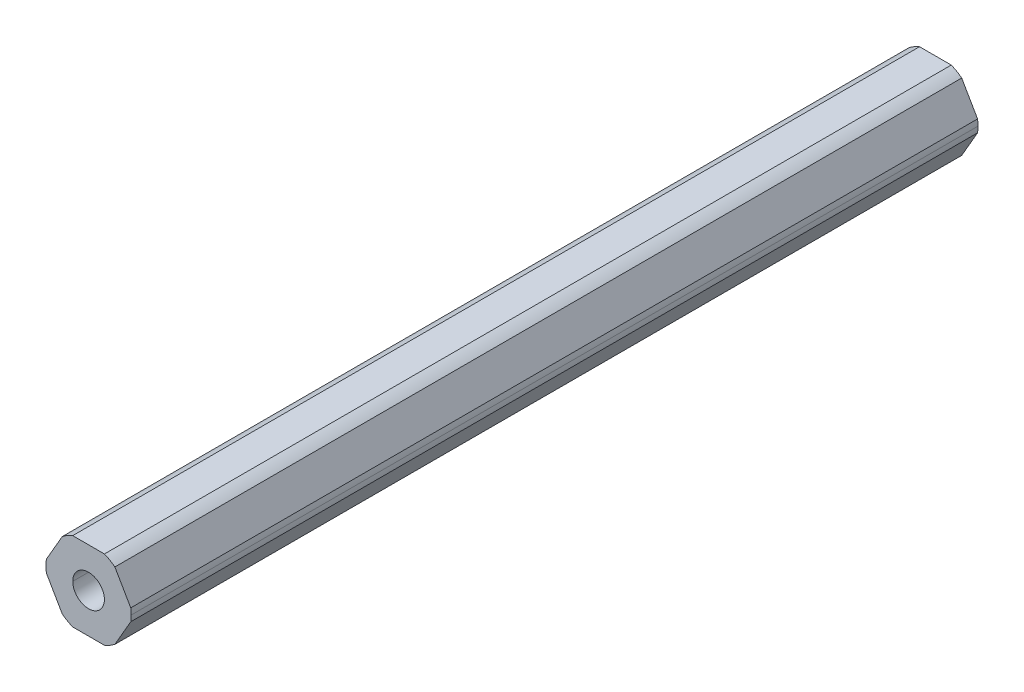
ISO-10303-21;
HEADER;
FILE_DESCRIPTION(('STEP AP214'),'2;1');
FILE_NAME('part.step','',(''),(''),'','','');
FILE_SCHEMA(('AUTOMOTIVE_DESIGN { 1 0 10303 214 1 1 1 1 }'));
ENDSEC;
DATA;
#1=APPLICATION_CONTEXT('core data for automotive mechanical design processes');
#2=APPLICATION_PROTOCOL_DEFINITION('international standard','automotive_design',2000,#1);
#3=PRODUCT_CONTEXT('',#1,'mechanical');
#4=PRODUCT('Part','Part','',(#3));
#5=PRODUCT_RELATED_PRODUCT_CATEGORY('part','',(#4));
#6=PRODUCT_DEFINITION_FORMATION('','',#4);
#7=PRODUCT_DEFINITION_CONTEXT('part definition',#1,'design');
#8=PRODUCT_DEFINITION('design','',#6,#7);
#9=PRODUCT_DEFINITION_SHAPE('','',#8);
#10=(LENGTH_UNIT() NAMED_UNIT(*) SI_UNIT(.MILLI.,.METRE.));
#11=(NAMED_UNIT(*) PLANE_ANGLE_UNIT() SI_UNIT($,.RADIAN.));
#12=(NAMED_UNIT(*) SI_UNIT($,.STERADIAN.) SOLID_ANGLE_UNIT());
#13=UNCERTAINTY_MEASURE_WITH_UNIT(LENGTH_MEASURE(1.E-05),#10,'distance_accuracy_value','');
#14=(GEOMETRIC_REPRESENTATION_CONTEXT(3) GLOBAL_UNCERTAINTY_ASSIGNED_CONTEXT((#13)) GLOBAL_UNIT_ASSIGNED_CONTEXT((#10,
#11,#12)) REPRESENTATION_CONTEXT('',''));
#15=CARTESIAN_POINT('',(0.,0.,0.));
#16=DIRECTION('',(0.,0.,1.));
#17=DIRECTION('',(1.,0.,0.));
#18=AXIS2_PLACEMENT_3D('',#15,#16,#17);
#19=CARTESIAN_POINT('',(0.,0.,-457.2));
#20=DIRECTION('',(0.,0.,1.));
#21=DIRECTION('',(1.,0.,0.));
#22=AXIS2_PLACEMENT_3D('',#19,#20,#21);
#23=CYLINDRICAL_SURFACE('',#22,2.55);
#24=CARTESIAN_POINT('',(0.,0.,-320.675));
#25=DIRECTION('',(0.,0.,1.));
#26=DIRECTION('',(1.,0.,0.));
#27=AXIS2_PLACEMENT_3D('',#24,#25,#26);
#28=CIRCLE('',#27,2.55);
#29=CARTESIAN_POINT('',(-2.55,0.,-320.675));
#30=VERTEX_POINT('',#29);
#31=CARTESIAN_POINT('',(2.55,0.,-320.675));
#32=VERTEX_POINT('',#31);
#33=EDGE_CURVE('E65',#30,#32,#28,.F.);
#34=ORIENTED_EDGE('',*,*,#33,.F.);
#35=DIRECTION('',(0.,0.,1.));
#36=VECTOR('',#35,1.);
#37=CARTESIAN_POINT('',(-2.55,0.,-457.2));
#38=LINE('',#37,#36);
#39=CARTESIAN_POINT('',(-2.55,0.,-457.2));
#40=VERTEX_POINT('',#39);
#41=EDGE_CURVE('E169',#40,#30,#38,.T.);
#42=ORIENTED_EDGE('',*,*,#41,.F.);
#43=CARTESIAN_POINT('',(0.,0.,-457.2));
#44=DIRECTION('',(0.,0.,1.));
#45=DIRECTION('',(1.,0.,0.));
#46=AXIS2_PLACEMENT_3D('',#43,#44,#45);
#47=CIRCLE('',#46,2.55);
#48=CARTESIAN_POINT('',(2.55,0.,-457.2));
#49=VERTEX_POINT('',#48);
#50=EDGE_CURVE('E52',#49,#40,#47,.T.);
#51=ORIENTED_EDGE('',*,*,#50,.F.);
#52=DIRECTION('',(0.,0.,1.));
#53=VECTOR('',#52,1.);
#54=CARTESIAN_POINT('',(2.55,0.,-457.2));
#55=LINE('',#54,#53);
#56=EDGE_CURVE('E171',#49,#32,#55,.T.);
#57=ORIENTED_EDGE('',*,*,#56,.T.);
#58=EDGE_LOOP('',(#34,#42,#51,#57));
#59=FACE_BOUND('',#58,.T.);
#60=ADVANCED_FACE('F44',(#59),#23,.F.);
#61=CARTESIAN_POINT('',(0.,0.,-457.2));
#62=DIRECTION('',(0.,0.,1.));
#63=DIRECTION('',(1.,0.,0.));
#64=AXIS2_PLACEMENT_3D('',#61,#62,#63);
#65=CYLINDRICAL_SURFACE('',#64,6.87);
#66=DIRECTION('',(0.,0.,1.));
#67=VECTOR('',#66,1.);
#68=CARTESIAN_POINT('',(2.55952629210952,6.3754,-457.2));
#69=LINE('',#68,#67);
#70=CARTESIAN_POINT('',(2.55952629210952,6.3754,-457.2));
#71=VERTEX_POINT('',#70);
#72=CARTESIAN_POINT('',(2.55952629210953,6.3754,-320.675));
#73=VERTEX_POINT('',#72);
#74=EDGE_CURVE('E213',#71,#73,#69,.T.);
#75=ORIENTED_EDGE('',*,*,#74,.T.);
#76=CARTESIAN_POINT('',(0.,0.,-320.675));
#77=DIRECTION('',(0.,0.,1.));
#78=DIRECTION('',(1.,0.,0.));
#79=AXIS2_PLACEMENT_3D('',#76,#77,#78);
#80=CIRCLE('',#79,6.87);
#81=CARTESIAN_POINT('',(4.24149521323254,5.40431479062105,-320.675));
#82=VERTEX_POINT('',#81);
#83=EDGE_CURVE('E285',#73,#82,#80,.F.);
#84=ORIENTED_EDGE('',*,*,#83,.T.);
#85=DIRECTION('',(0.,0.,-1.));
#86=VECTOR('',#85,1.);
#87=CARTESIAN_POINT('',(4.24149521323254,5.40431479062105,-457.2));
#88=LINE('',#87,#86);
#89=CARTESIAN_POINT('',(4.24149521323254,5.40431479062105,-457.2));
#90=VERTEX_POINT('',#89);
#91=EDGE_CURVE('E218',#82,#90,#88,.T.);
#92=ORIENTED_EDGE('',*,*,#91,.T.);
#93=CARTESIAN_POINT('',(0.,0.,-457.2));
#94=DIRECTION('',(0.,0.,1.));
#95=DIRECTION('',(1.,0.,0.));
#96=AXIS2_PLACEMENT_3D('',#93,#94,#95);
#97=CIRCLE('',#96,6.87);
#98=EDGE_CURVE('E244',#90,#71,#97,.T.);
#99=ORIENTED_EDGE('',*,*,#98,.T.);
#100=EDGE_LOOP('',(#75,#84,#92,#99));
#101=FACE_BOUND('',#100,.T.);
#102=ADVANCED_FACE('F324',(#101),#65,.T.);
#103=CARTESIAN_POINT('',(0.,0.,-457.2));
#104=DIRECTION('',(0.,0.,1.));
#105=DIRECTION('',(1.,0.,0.));
#106=AXIS2_PLACEMENT_3D('',#103,#104,#105);
#107=CYLINDRICAL_SURFACE('',#106,6.87);
#108=DIRECTION('',(0.,0.,1.));
#109=VECTOR('',#108,1.);
#110=CARTESIAN_POINT('',(-4.24149521323255,5.40431479062105,-457.2));
#111=LINE('',#110,#109);
#112=CARTESIAN_POINT('',(-4.24149521323255,5.40431479062105,-457.2));
#113=VERTEX_POINT('',#112);
#114=CARTESIAN_POINT('',(-4.24149521323255,5.40431479062105,-320.675));
#115=VERTEX_POINT('',#114);
#116=EDGE_CURVE('E243',#113,#115,#111,.T.);
#117=ORIENTED_EDGE('',*,*,#116,.T.);
#118=CARTESIAN_POINT('',(0.,0.,-320.675));
#119=DIRECTION('',(0.,0.,1.));
#120=DIRECTION('',(1.,0.,0.));
#121=AXIS2_PLACEMENT_3D('',#118,#119,#120);
#122=CIRCLE('',#121,6.87);
#123=CARTESIAN_POINT('',(-2.55952629210953,6.3754,-320.675));
#124=VERTEX_POINT('',#123);
#125=EDGE_CURVE('E275',#115,#124,#122,.F.);
#126=ORIENTED_EDGE('',*,*,#125,.T.);
#127=DIRECTION('',(0.,0.,-1.));
#128=VECTOR('',#127,1.);
#129=CARTESIAN_POINT('',(-2.55952629210953,6.3754,-457.2));
#130=LINE('',#129,#128);
#131=CARTESIAN_POINT('',(-2.55952629210953,6.3754,-457.2));
#132=VERTEX_POINT('',#131);
#133=EDGE_CURVE('E226',#124,#132,#130,.T.);
#134=ORIENTED_EDGE('',*,*,#133,.T.);
#135=CARTESIAN_POINT('',(0.,0.,-457.2));
#136=DIRECTION('',(0.,0.,1.));
#137=DIRECTION('',(1.,0.,0.));
#138=AXIS2_PLACEMENT_3D('',#135,#136,#137);
#139=CIRCLE('',#138,6.87);
#140=EDGE_CURVE('E222',#132,#113,#139,.T.);
#141=ORIENTED_EDGE('',*,*,#140,.T.);
#142=EDGE_LOOP('',(#117,#126,#134,#141));
#143=FACE_BOUND('',#142,.T.);
#144=ADVANCED_FACE('F335',(#143),#107,.T.);
#145=CARTESIAN_POINT('',(0.,0.,-457.2));
#146=DIRECTION('',(0.,0.,1.));
#147=DIRECTION('',(1.,0.,0.));
#148=AXIS2_PLACEMENT_3D('',#145,#146,#147);
#149=CYLINDRICAL_SURFACE('',#148,6.87);
#150=DIRECTION('',(0.,0.,1.));
#151=VECTOR('',#150,1.);
#152=CARTESIAN_POINT('',(-6.80102150534208,-0.971085209378962,-457.2));
#153=LINE('',#152,#151);
#154=CARTESIAN_POINT('',(-6.80102150534208,-0.971085209378956,-457.2));
#155=VERTEX_POINT('',#154);
#156=CARTESIAN_POINT('',(-6.80102150534207,-0.971085209378956,-320.675));
#157=VERTEX_POINT('',#156);
#158=EDGE_CURVE('E191',#155,#157,#153,.T.);
#159=ORIENTED_EDGE('',*,*,#158,.T.);
#160=CARTESIAN_POINT('',(0.,0.,-320.675));
#161=DIRECTION('',(0.,0.,1.));
#162=DIRECTION('',(1.,0.,0.));
#163=AXIS2_PLACEMENT_3D('',#160,#161,#162);
#164=CIRCLE('',#163,6.87);
#165=CARTESIAN_POINT('',(-6.80102150534208,0.97108520937896,-320.675));
#166=VERTEX_POINT('',#165);
#167=EDGE_CURVE('E278',#157,#166,#164,.F.);
#168=ORIENTED_EDGE('',*,*,#167,.T.);
#169=DIRECTION('',(0.,0.,-1.));
#170=VECTOR('',#169,1.);
#171=CARTESIAN_POINT('',(-6.80102150534208,0.97108520937896,-457.2));
#172=LINE('',#171,#170);
#173=CARTESIAN_POINT('',(-6.80102150534208,0.97108520937896,-457.2));
#174=VERTEX_POINT('',#173);
#175=EDGE_CURVE('E210',#166,#174,#172,.T.);
#176=ORIENTED_EDGE('',*,*,#175,.T.);
#177=CARTESIAN_POINT('',(0.,0.,-457.2));
#178=DIRECTION('',(0.,0.,1.));
#179=DIRECTION('',(1.,0.,0.));
#180=AXIS2_PLACEMENT_3D('',#177,#178,#179);
#181=CIRCLE('',#180,6.87);
#182=EDGE_CURVE('E233',#174,#155,#181,.T.);
#183=ORIENTED_EDGE('',*,*,#182,.T.);
#184=EDGE_LOOP('',(#159,#168,#176,#183));
#185=FACE_BOUND('',#184,.T.);
#186=ADVANCED_FACE('F342',(#185),#149,.T.);
#187=CARTESIAN_POINT('',(0.,0.,-457.2));
#188=DIRECTION('',(0.,0.,1.));
#189=DIRECTION('',(1.,0.,0.));
#190=AXIS2_PLACEMENT_3D('',#187,#188,#189);
#191=CYLINDRICAL_SURFACE('',#190,6.87);
#192=DIRECTION('',(0.,0.,1.));
#193=VECTOR('',#192,1.);
#194=CARTESIAN_POINT('',(-2.55952629210953,-6.3754,-457.2));
#195=LINE('',#194,#193);
#196=CARTESIAN_POINT('',(-2.55952629210953,-6.3754,-457.2));
#197=VERTEX_POINT('',#196);
#198=CARTESIAN_POINT('',(-2.55952629210953,-6.3754,-320.675));
#199=VERTEX_POINT('',#198);
#200=EDGE_CURVE('E202',#197,#199,#195,.T.);
#201=ORIENTED_EDGE('',*,*,#200,.T.);
#202=CARTESIAN_POINT('',(0.,0.,-320.675));
#203=DIRECTION('',(0.,0.,1.));
#204=DIRECTION('',(1.,0.,0.));
#205=AXIS2_PLACEMENT_3D('',#202,#203,#204);
#206=CIRCLE('',#205,6.87);
#207=CARTESIAN_POINT('',(-4.24149521323254,-5.40431479062105,-320.675));
#208=VERTEX_POINT('',#207);
#209=EDGE_CURVE('E288',#199,#208,#206,.F.);
#210=ORIENTED_EDGE('',*,*,#209,.T.);
#211=DIRECTION('',(0.,0.,-1.));
#212=VECTOR('',#211,1.);
#213=CARTESIAN_POINT('',(-4.24149521323255,-5.40431479062104,-457.2));
#214=LINE('',#213,#212);
#215=CARTESIAN_POINT('',(-4.24149521323254,-5.40431479062105,-457.2));
#216=VERTEX_POINT('',#215);
#217=EDGE_CURVE('E190',#208,#216,#214,.T.);
#218=ORIENTED_EDGE('',*,*,#217,.T.);
#219=CARTESIAN_POINT('',(0.,0.,-457.2));
#220=DIRECTION('',(0.,0.,1.));
#221=DIRECTION('',(1.,0.,0.));
#222=AXIS2_PLACEMENT_3D('',#219,#220,#221);
#223=CIRCLE('',#222,6.87);
#224=EDGE_CURVE('E236',#216,#197,#223,.T.);
#225=ORIENTED_EDGE('',*,*,#224,.T.);
#226=EDGE_LOOP('',(#201,#210,#218,#225));
#227=FACE_BOUND('',#226,.T.);
#228=ADVANCED_FACE('F351',(#227),#191,.T.);
#229=CARTESIAN_POINT('',(0.,0.,-457.2));
#230=DIRECTION('',(0.,0.,1.));
#231=DIRECTION('',(1.,0.,0.));
#232=AXIS2_PLACEMENT_3D('',#229,#230,#231);
#233=CYLINDRICAL_SURFACE('',#232,6.87);
#234=DIRECTION('',(0.,0.,1.));
#235=VECTOR('',#234,1.);
#236=CARTESIAN_POINT('',(4.24149521323255,-5.40431479062104,-457.2));
#237=LINE('',#236,#235);
#238=CARTESIAN_POINT('',(4.24149521323254,-5.40431479062105,-457.2));
#239=VERTEX_POINT('',#238);
#240=CARTESIAN_POINT('',(4.24149521323254,-5.40431479062105,-320.675));
#241=VERTEX_POINT('',#240);
#242=EDGE_CURVE('E195',#239,#241,#237,.T.);
#243=ORIENTED_EDGE('',*,*,#242,.T.);
#244=CARTESIAN_POINT('',(0.,0.,-320.675));
#245=DIRECTION('',(0.,0.,1.));
#246=DIRECTION('',(1.,0.,0.));
#247=AXIS2_PLACEMENT_3D('',#244,#245,#246);
#248=CIRCLE('',#247,6.87);
#249=CARTESIAN_POINT('',(2.55952629210953,-6.3754,-320.675));
#250=VERTEX_POINT('',#249);
#251=EDGE_CURVE('E295',#241,#250,#248,.F.);
#252=ORIENTED_EDGE('',*,*,#251,.T.);
#253=DIRECTION('',(0.,0.,-1.));
#254=VECTOR('',#253,1.);
#255=CARTESIAN_POINT('',(2.55952629210953,-6.3754,-457.2));
#256=LINE('',#255,#254);
#257=CARTESIAN_POINT('',(2.55952629210953,-6.3754,-457.2));
#258=VERTEX_POINT('',#257);
#259=EDGE_CURVE('E201',#250,#258,#256,.T.);
#260=ORIENTED_EDGE('',*,*,#259,.T.);
#261=CARTESIAN_POINT('',(0.,0.,-457.2));
#262=DIRECTION('',(0.,0.,1.));
#263=DIRECTION('',(1.,0.,0.));
#264=AXIS2_PLACEMENT_3D('',#261,#262,#263);
#265=CIRCLE('',#264,6.87);
#266=EDGE_CURVE('E239',#258,#239,#265,.T.);
#267=ORIENTED_EDGE('',*,*,#266,.T.);
#268=EDGE_LOOP('',(#243,#252,#260,#267));
#269=FACE_BOUND('',#268,.T.);
#270=ADVANCED_FACE('F358',(#269),#233,.T.);
#271=CARTESIAN_POINT('',(0.,0.,-457.2));
#272=DIRECTION('',(0.,0.,1.));
#273=DIRECTION('',(1.,0.,0.));
#274=AXIS2_PLACEMENT_3D('',#271,#272,#273);
#275=CYLINDRICAL_SURFACE('',#274,6.87);
#276=DIRECTION('',(0.,0.,1.));
#277=VECTOR('',#276,1.);
#278=CARTESIAN_POINT('',(6.80102150534208,0.971085209378949,-457.2));
#279=LINE('',#278,#277);
#280=CARTESIAN_POINT('',(6.80102150534208,0.97108520937895,-457.2));
#281=VERTEX_POINT('',#280);
#282=CARTESIAN_POINT('',(6.80102150534208,0.97108520937895,-320.675));
#283=VERTEX_POINT('',#282);
#284=EDGE_CURVE('E203',#281,#283,#279,.T.);
#285=ORIENTED_EDGE('',*,*,#284,.T.);
#286=CARTESIAN_POINT('',(0.,0.,-320.675));
#287=DIRECTION('',(0.,0.,1.));
#288=DIRECTION('',(1.,0.,0.));
#289=AXIS2_PLACEMENT_3D('',#286,#287,#288);
#290=CIRCLE('',#289,6.87);
#291=CARTESIAN_POINT('',(6.87,0.,-320.675));
#292=VERTEX_POINT('',#291);
#293=EDGE_CURVE('E298',#283,#292,#290,.F.);
#294=ORIENTED_EDGE('',*,*,#293,.T.);
#295=DIRECTION('',(0.,0.,1.));
#296=VECTOR('',#295,1.);
#297=CARTESIAN_POINT('',(6.87,0.,-457.2));
#298=LINE('',#297,#296);
#299=CARTESIAN_POINT('',(6.87,0.,-457.2));
#300=VERTEX_POINT('',#299);
#301=EDGE_CURVE('E196',#300,#292,#298,.T.);
#302=ORIENTED_EDGE('',*,*,#301,.F.);
#303=CARTESIAN_POINT('',(0.,0.,-457.2));
#304=DIRECTION('',(0.,0.,1.));
#305=DIRECTION('',(1.,0.,0.));
#306=AXIS2_PLACEMENT_3D('',#303,#304,#305);
#307=CIRCLE('',#306,6.87);
#308=EDGE_CURVE('E247',#300,#281,#307,.T.);
#309=ORIENTED_EDGE('',*,*,#308,.T.);
#310=EDGE_LOOP('',(#285,#294,#302,#309));
#311=FACE_BOUND('',#310,.T.);
#312=ADVANCED_FACE('F318',(#311),#275,.T.);
#313=CARTESIAN_POINT('',(-3.68083890619154,-6.3754,457.2));
#314=DIRECTION('',(0.,1.,0.));
#315=DIRECTION('',(1.,0.,0.));
#316=AXIS2_PLACEMENT_3D('',#313,#314,#315);
#317=PLANE('',#316);
#318=DIRECTION('',(1.,0.,0.));
#319=VECTOR('',#318,1.);
#320=CARTESIAN_POINT('',(-3.68083890619154,-6.3754,-320.675));
#321=LINE('',#320,#319);
#322=EDGE_CURVE('E291',#199,#250,#321,.T.);
#323=ORIENTED_EDGE('',*,*,#322,.F.);
#324=ORIENTED_EDGE('',*,*,#200,.F.);
#325=DIRECTION('',(1.,0.,0.));
#326=VECTOR('',#325,1.);
#327=CARTESIAN_POINT('',(-3.68083890619154,-6.3754,-457.2));
#328=LINE('',#327,#326);
#329=EDGE_CURVE('E197',#197,#258,#328,.T.);
#330=ORIENTED_EDGE('',*,*,#329,.T.);
#331=ORIENTED_EDGE('',*,*,#259,.F.);
#332=EDGE_LOOP('',(#323,#324,#330,#331));
#333=FACE_BOUND('',#332,.T.);
#334=ADVANCED_FACE('F46',(#333),#317,.F.);
#335=CARTESIAN_POINT('',(-7.36167781238308,0.,457.2));
#336=DIRECTION('',(0.866025403784439,0.5,0.));
#337=DIRECTION('',(0.,0.,-1.));
#338=AXIS2_PLACEMENT_3D('',#335,#336,#337);
#339=PLANE('',#338);
#340=DIRECTION('',(0.5,-0.866025403784439,0.));
#341=VECTOR('',#340,1.);
#342=CARTESIAN_POINT('',(-7.36167781238308,0.,-320.675));
#343=LINE('',#342,#341);
#344=EDGE_CURVE('E281',#157,#208,#343,.T.);
#345=ORIENTED_EDGE('',*,*,#344,.F.);
#346=ORIENTED_EDGE('',*,*,#158,.F.);
#347=DIRECTION('',(0.5,-0.866025403784439,0.));
#348=VECTOR('',#347,1.);
#349=CARTESIAN_POINT('',(-7.36167781238308,0.,-457.2));
#350=LINE('',#349,#348);
#351=EDGE_CURVE('E188',#155,#216,#350,.T.);
#352=ORIENTED_EDGE('',*,*,#351,.T.);
#353=ORIENTED_EDGE('',*,*,#217,.F.);
#354=EDGE_LOOP('',(#345,#346,#352,#353));
#355=FACE_BOUND('',#354,.T.);
#356=ADVANCED_FACE('F347',(#355),#339,.F.);
#357=CARTESIAN_POINT('',(-3.68083890619154,6.3754,457.2));
#358=DIRECTION('',(0.866025403784439,-0.5,0.));
#359=DIRECTION('',(0.,0.,-1.));
#360=AXIS2_PLACEMENT_3D('',#357,#358,#359);
#361=PLANE('',#360);
#362=DIRECTION('',(-0.5,-0.866025403784439,0.));
#363=VECTOR('',#362,1.);
#364=CARTESIAN_POINT('',(-3.68083890619154,6.3754,-320.675));
#365=LINE('',#364,#363);
#366=EDGE_CURVE('E185',#115,#166,#365,.T.);
#367=ORIENTED_EDGE('',*,*,#366,.F.);
#368=ORIENTED_EDGE('',*,*,#116,.F.);
#369=DIRECTION('',(-0.5,-0.866025403784439,0.));
#370=VECTOR('',#369,1.);
#371=CARTESIAN_POINT('',(-3.68083890619154,6.3754,-457.2));
#372=LINE('',#371,#370);
#373=EDGE_CURVE('E212',#113,#174,#372,.T.);
#374=ORIENTED_EDGE('',*,*,#373,.T.);
#375=ORIENTED_EDGE('',*,*,#175,.F.);
#376=EDGE_LOOP('',(#367,#368,#374,#375));
#377=FACE_BOUND('',#376,.T.);
#378=ADVANCED_FACE('F338',(#377),#361,.F.);
#379=CARTESIAN_POINT('',(3.68083890619154,6.3754,457.2));
#380=DIRECTION('',(0.,-1.,0.));
#381=DIRECTION('',(0.,0.,-1.));
#382=AXIS2_PLACEMENT_3D('',#379,#380,#381);
#383=PLANE('',#382);
#384=DIRECTION('',(-1.,0.,0.));
#385=VECTOR('',#384,1.);
#386=CARTESIAN_POINT('',(3.68083890619154,6.3754,-320.675));
#387=LINE('',#386,#385);
#388=EDGE_CURVE('E283',#73,#124,#387,.T.);
#389=ORIENTED_EDGE('',*,*,#388,.F.);
#390=ORIENTED_EDGE('',*,*,#74,.F.);
#391=DIRECTION('',(-1.,0.,0.));
#392=VECTOR('',#391,1.);
#393=CARTESIAN_POINT('',(3.68083890619154,6.3754,-457.2));
#394=LINE('',#393,#392);
#395=EDGE_CURVE('E217',#71,#132,#394,.T.);
#396=ORIENTED_EDGE('',*,*,#395,.T.);
#397=ORIENTED_EDGE('',*,*,#133,.F.);
#398=EDGE_LOOP('',(#389,#390,#396,#397));
#399=FACE_BOUND('',#398,.T.);
#400=ADVANCED_FACE('F332',(#399),#383,.F.);
#401=CARTESIAN_POINT('',(7.36167781238308,0.,457.2));
#402=DIRECTION('',(-0.866025403784439,-0.5,0.));
#403=DIRECTION('',(-0.5,0.866025403784439,0.));
#404=AXIS2_PLACEMENT_3D('',#401,#402,#403);
#405=PLANE('',#404);
#406=DIRECTION('',(-0.5,0.866025403784439,0.));
#407=VECTOR('',#406,1.);
#408=CARTESIAN_POINT('',(7.36167781238308,0.,-320.675));
#409=LINE('',#408,#407);
#410=EDGE_CURVE('E293',#283,#82,#409,.T.);
#411=ORIENTED_EDGE('',*,*,#410,.F.);
#412=ORIENTED_EDGE('',*,*,#284,.F.);
#413=DIRECTION('',(-0.5,0.866025403784439,0.));
#414=VECTOR('',#413,1.);
#415=CARTESIAN_POINT('',(7.36167781238308,0.,-457.2));
#416=LINE('',#415,#414);
#417=EDGE_CURVE('E207',#281,#90,#416,.T.);
#418=ORIENTED_EDGE('',*,*,#417,.T.);
#419=ORIENTED_EDGE('',*,*,#91,.F.);
#420=EDGE_LOOP('',(#411,#412,#418,#419));
#421=FACE_BOUND('',#420,.T.);
#422=ADVANCED_FACE('F322',(#421),#405,.F.);
#423=CARTESIAN_POINT('',(3.68083890619154,-6.3754,457.2));
#424=DIRECTION('',(-0.866025403784439,0.5,0.));
#425=DIRECTION('',(0.,0.,1.));
#426=AXIS2_PLACEMENT_3D('',#423,#424,#425);
#427=PLANE('',#426);
#428=DIRECTION('',(0.5,0.866025403784439,0.));
#429=VECTOR('',#428,1.);
#430=CARTESIAN_POINT('',(3.68083890619154,-6.3754,-320.675));
#431=LINE('',#430,#429);
#432=CARTESIAN_POINT('',(6.80102150534208,-0.971085209378962,-320.675));
#433=VERTEX_POINT('',#432);
#434=EDGE_CURVE('E59',#241,#433,#431,.T.);
#435=ORIENTED_EDGE('',*,*,#434,.F.);
#436=ORIENTED_EDGE('',*,*,#242,.F.);
#437=DIRECTION('',(0.5,0.866025403784439,0.));
#438=VECTOR('',#437,1.);
#439=CARTESIAN_POINT('',(3.68083890619154,-6.3754,-457.2));
#440=LINE('',#439,#438);
#441=CARTESIAN_POINT('',(6.80102150534208,-0.971085209378955,-457.2));
#442=VERTEX_POINT('',#441);
#443=EDGE_CURVE('E208',#239,#442,#440,.T.);
#444=ORIENTED_EDGE('',*,*,#443,.T.);
#445=DIRECTION('',(0.,0.,-1.));
#446=VECTOR('',#445,1.);
#447=CARTESIAN_POINT('',(6.80102150534208,-0.971085209378962,-457.2));
#448=LINE('',#447,#446);
#449=EDGE_CURVE('E193',#433,#442,#448,.T.);
#450=ORIENTED_EDGE('',*,*,#449,.F.);
#451=EDGE_LOOP('',(#435,#436,#444,#450));
#452=FACE_BOUND('',#451,.T.);
#453=ADVANCED_FACE('F307',(#452),#427,.F.);
#454=CARTESIAN_POINT('',(0.,0.,-457.2));
#455=DIRECTION('',(0.,0.,1.));
#456=DIRECTION('',(1.,0.,0.));
#457=AXIS2_PLACEMENT_3D('',#454,#455,#456);
#458=CYLINDRICAL_SURFACE('',#457,6.87);
#459=ORIENTED_EDGE('',*,*,#301,.T.);
#460=CARTESIAN_POINT('',(0.,0.,-320.675));
#461=DIRECTION('',(0.,0.,1.));
#462=DIRECTION('',(1.,0.,0.));
#463=AXIS2_PLACEMENT_3D('',#460,#461,#462);
#464=CIRCLE('',#463,6.87);
#465=EDGE_CURVE('E172',#292,#433,#464,.F.);
#466=ORIENTED_EDGE('',*,*,#465,.T.);
#467=ORIENTED_EDGE('',*,*,#449,.T.);
#468=CARTESIAN_POINT('',(0.,0.,-457.2));
#469=DIRECTION('',(0.,0.,1.));
#470=DIRECTION('',(1.,0.,0.));
#471=AXIS2_PLACEMENT_3D('',#468,#469,#470);
#472=CIRCLE('',#471,6.87);
#473=EDGE_CURVE('E182',#442,#300,#472,.T.);
#474=ORIENTED_EDGE('',*,*,#473,.T.);
#475=EDGE_LOOP('',(#459,#466,#467,#474));
#476=FACE_BOUND('',#475,.T.);
#477=ADVANCED_FACE('F304',(#476),#458,.T.);
#478=CARTESIAN_POINT('',(0.,0.,-457.2));
#479=DIRECTION('',(0.,0.,1.));
#480=DIRECTION('',(1.,0.,0.));
#481=AXIS2_PLACEMENT_3D('',#478,#479,#480);
#482=CYLINDRICAL_SURFACE('',#481,2.55);
#483=CARTESIAN_POINT('',(0.,0.,-320.675));
#484=DIRECTION('',(0.,0.,1.));
#485=DIRECTION('',(1.,0.,0.));
#486=AXIS2_PLACEMENT_3D('',#483,#484,#485);
#487=CIRCLE('',#486,2.55);
#488=EDGE_CURVE('E11',#32,#30,#487,.F.);
#489=ORIENTED_EDGE('',*,*,#488,.F.);
#490=ORIENTED_EDGE('',*,*,#56,.F.);
#491=CARTESIAN_POINT('',(0.,0.,-457.2));
#492=DIRECTION('',(0.,0.,1.));
#493=DIRECTION('',(1.,0.,0.));
#494=AXIS2_PLACEMENT_3D('',#491,#492,#493);
#495=CIRCLE('',#494,2.55);
#496=EDGE_CURVE('E176',#40,#49,#495,.T.);
#497=ORIENTED_EDGE('',*,*,#496,.F.);
#498=ORIENTED_EDGE('',*,*,#41,.T.);
#499=EDGE_LOOP('',(#489,#490,#497,#498));
#500=FACE_BOUND('',#499,.T.);
#501=ADVANCED_FACE('F174',(#500),#482,.F.);
#502=CARTESIAN_POINT('',(0.,0.,-457.2));
#503=DIRECTION('',(0.,0.,1.));
#504=DIRECTION('',(1.,0.,0.));
#505=AXIS2_PLACEMENT_3D('',#502,#503,#504);
#506=PLANE('',#505);
#507=ORIENTED_EDGE('',*,*,#50,.T.);
#508=ORIENTED_EDGE('',*,*,#496,.T.);
#509=EDGE_LOOP('',(#507,#508));
#510=FACE_BOUND('',#509,.T.);
#511=ORIENTED_EDGE('',*,*,#98,.F.);
#512=ORIENTED_EDGE('',*,*,#417,.F.);
#513=ORIENTED_EDGE('',*,*,#308,.F.);
#514=ORIENTED_EDGE('',*,*,#473,.F.);
#515=ORIENTED_EDGE('',*,*,#443,.F.);
#516=ORIENTED_EDGE('',*,*,#266,.F.);
#517=ORIENTED_EDGE('',*,*,#329,.F.);
#518=ORIENTED_EDGE('',*,*,#224,.F.);
#519=ORIENTED_EDGE('',*,*,#351,.F.);
#520=ORIENTED_EDGE('',*,*,#182,.F.);
#521=ORIENTED_EDGE('',*,*,#373,.F.);
#522=ORIENTED_EDGE('',*,*,#140,.F.);
#523=ORIENTED_EDGE('',*,*,#395,.F.);
#524=EDGE_LOOP('',(#511,#512,#513,#514,#515,#516,#517,#518,#519,#520,#521,#522,#523));
#525=FACE_BOUND('',#524,.T.);
#526=ADVANCED_FACE('F314',(#510,#525),#506,.F.);
#527=CARTESIAN_POINT('',(0.,0.,-320.675));
#528=DIRECTION('',(0.,0.,1.));
#529=DIRECTION('',(1.,0.,0.));
#530=AXIS2_PLACEMENT_3D('',#527,#528,#529);
#531=PLANE('',#530);
#532=ORIENTED_EDGE('',*,*,#33,.T.);
#533=ORIENTED_EDGE('',*,*,#488,.T.);
#534=EDGE_LOOP('',(#532,#533));
#535=FACE_BOUND('',#534,.T.);
#536=ORIENTED_EDGE('',*,*,#366,.T.);
#537=ORIENTED_EDGE('',*,*,#167,.F.);
#538=ORIENTED_EDGE('',*,*,#344,.T.);
#539=ORIENTED_EDGE('',*,*,#209,.F.);
#540=ORIENTED_EDGE('',*,*,#322,.T.);
#541=ORIENTED_EDGE('',*,*,#251,.F.);
#542=ORIENTED_EDGE('',*,*,#434,.T.);
#543=ORIENTED_EDGE('',*,*,#465,.F.);
#544=ORIENTED_EDGE('',*,*,#293,.F.);
#545=ORIENTED_EDGE('',*,*,#410,.T.);
#546=ORIENTED_EDGE('',*,*,#83,.F.);
#547=ORIENTED_EDGE('',*,*,#388,.T.);
#548=ORIENTED_EDGE('',*,*,#125,.F.);
#549=EDGE_LOOP('',(#536,#537,#538,#539,#540,#541,#542,#543,#544,#545,#546,#547,#548));
#550=FACE_BOUND('',#549,.T.);
#551=ADVANCED_FACE('F162',(#535,#550),#531,.T.);
#552=CLOSED_SHELL('',(#60,#102,#144,#186,#228,#270,#312,#334,#356,#378,#400,#422,#453,#477,#501,
#526,#551));
#553=MANIFOLD_SOLID_BREP('B2',#552);
#554=ADVANCED_BREP_SHAPE_REPRESENTATION('',(#18,#553),#14);
#555=SHAPE_DEFINITION_REPRESENTATION(#9,#554);
ENDSEC;
END-ISO-10303-21;
